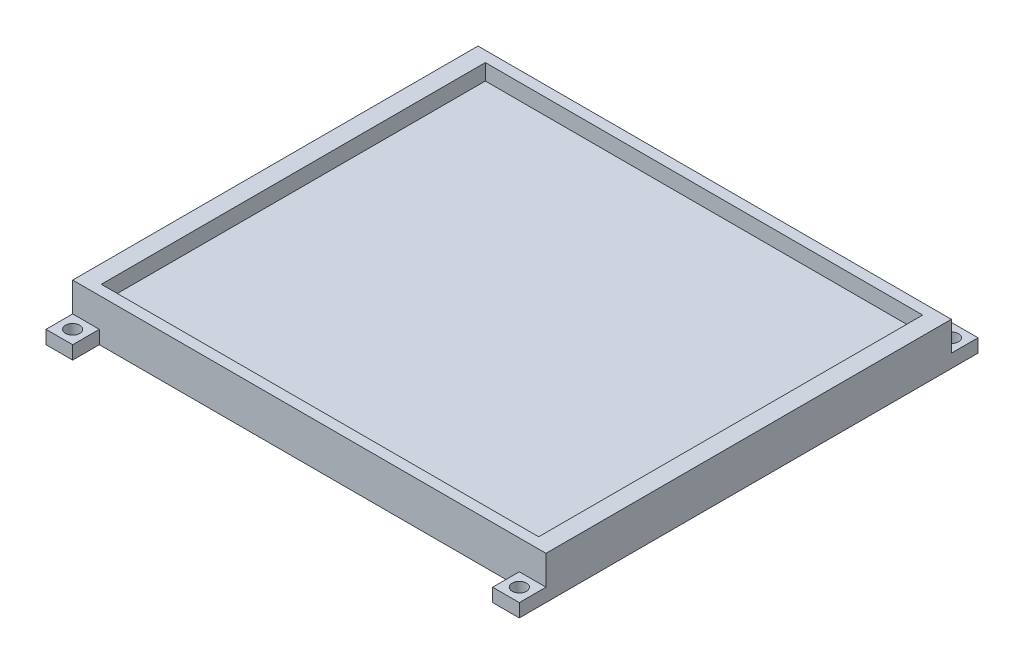
ISO-10303-21;
HEADER;
FILE_DESCRIPTION(('STEP AP214'),'2;1');
FILE_NAME('part.step','',(''),(''),'','','');
FILE_SCHEMA(('AUTOMOTIVE_DESIGN { 1 0 10303 214 1 1 1 1 }'));
ENDSEC;
DATA;
#1=APPLICATION_CONTEXT('core data for automotive mechanical design processes');
#2=APPLICATION_PROTOCOL_DEFINITION('international standard','automotive_design',2000,#1);
#3=PRODUCT_CONTEXT('',#1,'mechanical');
#4=PRODUCT('Part','Part','',(#3));
#5=PRODUCT_RELATED_PRODUCT_CATEGORY('part','',(#4));
#6=PRODUCT_DEFINITION_FORMATION('','',#4);
#7=PRODUCT_DEFINITION_CONTEXT('part definition',#1,'design');
#8=PRODUCT_DEFINITION('design','',#6,#7);
#9=PRODUCT_DEFINITION_SHAPE('','',#8);
#10=(LENGTH_UNIT() NAMED_UNIT(*) SI_UNIT(.MILLI.,.METRE.));
#11=(NAMED_UNIT(*) PLANE_ANGLE_UNIT() SI_UNIT($,.RADIAN.));
#12=(NAMED_UNIT(*) SI_UNIT($,.STERADIAN.) SOLID_ANGLE_UNIT());
#13=UNCERTAINTY_MEASURE_WITH_UNIT(LENGTH_MEASURE(1.E-05),#10,'distance_accuracy_value','');
#14=(GEOMETRIC_REPRESENTATION_CONTEXT(3) GLOBAL_UNCERTAINTY_ASSIGNED_CONTEXT((#13)) GLOBAL_UNIT_ASSIGNED_CONTEXT((#10,
#11,#12)) REPRESENTATION_CONTEXT('',''));
#15=CARTESIAN_POINT('',(0.,0.,0.));
#16=DIRECTION('',(0.,0.,1.));
#17=DIRECTION('',(1.,0.,0.));
#18=AXIS2_PLACEMENT_3D('',#15,#16,#17);
#19=CARTESIAN_POINT('',(0.,10.16,-96.52));
#20=DIRECTION('',(0.,0.,1.));
#21=DIRECTION('',(1.,0.,0.));
#22=AXIS2_PLACEMENT_3D('',#19,#20,#21);
#23=PLANE('',#22);
#24=DIRECTION('',(-1.,0.,0.));
#25=VECTOR('',#24,1.);
#26=CARTESIAN_POINT('',(112.699999898,3.175,-96.52));
#27=LINE('',#26,#25);
#28=CARTESIAN_POINT('',(112.699999898,3.175,-96.52));
#29=VERTEX_POINT('',#28);
#30=CARTESIAN_POINT('',(106.349999898,3.175,-96.52));
#31=VERTEX_POINT('',#30);
#32=EDGE_CURVE('E62',#29,#31,#27,.T.);
#33=ORIENTED_EDGE('',*,*,#32,.T.);
#34=DIRECTION('',(0.,-1.,0.));
#35=VECTOR('',#34,1.);
#36=CARTESIAN_POINT('',(106.349999898,3.175,-96.52));
#37=LINE('',#36,#35);
#38=CARTESIAN_POINT('',(106.349999898,0.,-96.52));
#39=VERTEX_POINT('',#38);
#40=EDGE_CURVE('E239',#31,#39,#37,.T.);
#41=ORIENTED_EDGE('',*,*,#40,.T.);
#42=DIRECTION('',(-1.,0.,0.));
#43=VECTOR('',#42,1.);
#44=CARTESIAN_POINT('',(0.,0.,-96.52));
#45=LINE('',#44,#43);
#46=CARTESIAN_POINT('',(6.35,0.,-96.52));
#47=VERTEX_POINT('',#46);
#48=EDGE_CURVE('E397',#39,#47,#45,.T.);
#49=ORIENTED_EDGE('',*,*,#48,.T.);
#50=DIRECTION('',(0.,-1.,0.));
#51=VECTOR('',#50,1.);
#52=CARTESIAN_POINT('',(6.35,3.175,-96.52));
#53=LINE('',#52,#51);
#54=CARTESIAN_POINT('',(6.35,3.175,-96.52));
#55=VERTEX_POINT('',#54);
#56=EDGE_CURVE('E265',#55,#47,#53,.T.);
#57=ORIENTED_EDGE('',*,*,#56,.F.);
#58=DIRECTION('',(-1.,0.,0.));
#59=VECTOR('',#58,1.);
#60=CARTESIAN_POINT('',(0.,3.175,-96.52));
#61=LINE('',#60,#59);
#62=CARTESIAN_POINT('',(0.,3.175,-96.52));
#63=VERTEX_POINT('',#62);
#64=EDGE_CURVE('E271',#55,#63,#61,.T.);
#65=ORIENTED_EDGE('',*,*,#64,.T.);
#66=DIRECTION('',(0.,-1.,0.));
#67=VECTOR('',#66,1.);
#68=CARTESIAN_POINT('',(0.,10.16,-96.52));
#69=LINE('',#68,#67);
#70=CARTESIAN_POINT('',(0.,10.16,-96.52));
#71=VERTEX_POINT('',#70);
#72=EDGE_CURVE('E403',#71,#63,#69,.T.);
#73=ORIENTED_EDGE('',*,*,#72,.F.);
#74=DIRECTION('',(-1.,0.,0.));
#75=VECTOR('',#74,1.);
#76=CARTESIAN_POINT('',(0.,10.16,-96.52));
#77=LINE('',#76,#75);
#78=CARTESIAN_POINT('',(112.699999898,10.16,-96.52));
#79=VERTEX_POINT('',#78);
#80=EDGE_CURVE('E401',#79,#71,#77,.T.);
#81=ORIENTED_EDGE('',*,*,#80,.F.);
#82=DIRECTION('',(0.,-1.,0.));
#83=VECTOR('',#82,1.);
#84=CARTESIAN_POINT('',(112.699999898,10.16,-96.52));
#85=LINE('',#84,#83);
#86=EDGE_CURVE('E412',#79,#29,#85,.T.);
#87=ORIENTED_EDGE('',*,*,#86,.T.);
#88=EDGE_LOOP('',(#33,#41,#49,#57,#65,#73,#81,#87));
#89=FACE_BOUND('',#88,.T.);
#90=ADVANCED_FACE('F39',(#89),#23,.F.);
#91=CARTESIAN_POINT('',(0.,10.16,0.));
#92=DIRECTION('',(0.,0.,-1.));
#93=DIRECTION('',(-1.,0.,0.));
#94=AXIS2_PLACEMENT_3D('',#91,#92,#93);
#95=PLANE('',#94);
#96=DIRECTION('',(1.,0.,0.));
#97=VECTOR('',#96,1.);
#98=CARTESIAN_POINT('',(0.,3.175,0.));
#99=LINE('',#98,#97);
#100=CARTESIAN_POINT('',(0.,3.175,0.));
#101=VERTEX_POINT('',#100);
#102=CARTESIAN_POINT('',(6.35,3.175,0.));
#103=VERTEX_POINT('',#102);
#104=EDGE_CURVE('E320',#101,#103,#99,.T.);
#105=ORIENTED_EDGE('',*,*,#104,.T.);
#106=DIRECTION('',(0.,-1.,0.));
#107=VECTOR('',#106,1.);
#108=CARTESIAN_POINT('',(6.35,3.175,0.));
#109=LINE('',#108,#107);
#110=CARTESIAN_POINT('',(6.35,0.,0.));
#111=VERTEX_POINT('',#110);
#112=EDGE_CURVE('E299',#103,#111,#109,.T.);
#113=ORIENTED_EDGE('',*,*,#112,.T.);
#114=DIRECTION('',(1.,0.,0.));
#115=VECTOR('',#114,1.);
#116=CARTESIAN_POINT('',(0.,0.,0.));
#117=LINE('',#116,#115);
#118=CARTESIAN_POINT('',(106.349999898,0.,0.));
#119=VERTEX_POINT('',#118);
#120=EDGE_CURVE('E405',#111,#119,#117,.T.);
#121=ORIENTED_EDGE('',*,*,#120,.T.);
#122=DIRECTION('',(0.,-1.,0.));
#123=VECTOR('',#122,1.);
#124=CARTESIAN_POINT('',(106.349999898,3.175,0.));
#125=LINE('',#124,#123);
#126=CARTESIAN_POINT('',(106.349999898,3.175,0.));
#127=VERTEX_POINT('',#126);
#128=EDGE_CURVE('E353',#127,#119,#125,.T.);
#129=ORIENTED_EDGE('',*,*,#128,.F.);
#130=DIRECTION('',(1.,0.,0.));
#131=VECTOR('',#130,1.);
#132=CARTESIAN_POINT('',(112.699999898,3.175,0.));
#133=LINE('',#132,#131);
#134=CARTESIAN_POINT('',(112.699999898,3.175,0.));
#135=VERTEX_POINT('',#134);
#136=EDGE_CURVE('E345',#127,#135,#133,.T.);
#137=ORIENTED_EDGE('',*,*,#136,.T.);
#138=DIRECTION('',(0.,-1.,0.));
#139=VECTOR('',#138,1.);
#140=CARTESIAN_POINT('',(112.699999898,10.16,0.));
#141=LINE('',#140,#139);
#142=CARTESIAN_POINT('',(112.699999898,10.16,0.));
#143=VERTEX_POINT('',#142);
#144=EDGE_CURVE('E47',#143,#135,#141,.T.);
#145=ORIENTED_EDGE('',*,*,#144,.F.);
#146=DIRECTION('',(1.,0.,0.));
#147=VECTOR('',#146,1.);
#148=CARTESIAN_POINT('',(0.,10.16,0.));
#149=LINE('',#148,#147);
#150=CARTESIAN_POINT('',(0.,10.16,0.));
#151=VERTEX_POINT('',#150);
#152=EDGE_CURVE('E396',#151,#143,#149,.T.);
#153=ORIENTED_EDGE('',*,*,#152,.F.);
#154=DIRECTION('',(0.,-1.,0.));
#155=VECTOR('',#154,1.);
#156=CARTESIAN_POINT('',(0.,10.16,0.));
#157=LINE('',#156,#155);
#158=EDGE_CURVE('E11',#151,#101,#157,.T.);
#159=ORIENTED_EDGE('',*,*,#158,.T.);
#160=EDGE_LOOP('',(#105,#113,#121,#129,#137,#145,#153,#159));
#161=FACE_BOUND('',#160,.T.);
#162=ADVANCED_FACE('F420',(#161),#95,.F.);
#163=CARTESIAN_POINT('',(0.,10.16,0.));
#164=DIRECTION('',(1.,0.,0.));
#165=DIRECTION('',(0.,0.,-1.));
#166=AXIS2_PLACEMENT_3D('',#163,#164,#165);
#167=PLANE('',#166);
#168=DIRECTION('',(0.,0.,1.));
#169=VECTOR('',#168,1.);
#170=CARTESIAN_POINT('',(0.,0.,0.));
#171=LINE('',#170,#169);
#172=CARTESIAN_POINT('',(0.,0.,-102.87));
#173=VERTEX_POINT('',#172);
#174=CARTESIAN_POINT('',(0.,0.,6.35));
#175=VERTEX_POINT('',#174);
#176=EDGE_CURVE('E386',#173,#175,#171,.T.);
#177=ORIENTED_EDGE('',*,*,#176,.T.);
#178=DIRECTION('',(0.,-1.,0.));
#179=VECTOR('',#178,1.);
#180=CARTESIAN_POINT('',(0.,3.175,6.35));
#181=LINE('',#180,#179);
#182=CARTESIAN_POINT('',(0.,3.175,6.35));
#183=VERTEX_POINT('',#182);
#184=EDGE_CURVE('E296',#183,#175,#181,.T.);
#185=ORIENTED_EDGE('',*,*,#184,.F.);
#186=DIRECTION('',(0.,0.,-1.));
#187=VECTOR('',#186,1.);
#188=CARTESIAN_POINT('',(0.,3.175,0.));
#189=LINE('',#188,#187);
#190=EDGE_CURVE('E311',#183,#101,#189,.T.);
#191=ORIENTED_EDGE('',*,*,#190,.T.);
#192=ORIENTED_EDGE('',*,*,#158,.F.);
#193=DIRECTION('',(0.,0.,1.));
#194=VECTOR('',#193,1.);
#195=CARTESIAN_POINT('',(0.,10.16,0.));
#196=LINE('',#195,#194);
#197=EDGE_CURVE('E393',#71,#151,#196,.T.);
#198=ORIENTED_EDGE('',*,*,#197,.F.);
#199=ORIENTED_EDGE('',*,*,#72,.T.);
#200=DIRECTION('',(0.,0.,-1.));
#201=VECTOR('',#200,1.);
#202=CARTESIAN_POINT('',(0.,3.175,-96.52));
#203=LINE('',#202,#201);
#204=CARTESIAN_POINT('',(0.,3.175,-102.87));
#205=VERTEX_POINT('',#204);
#206=EDGE_CURVE('E280',#63,#205,#203,.T.);
#207=ORIENTED_EDGE('',*,*,#206,.T.);
#208=DIRECTION('',(0.,-1.,0.));
#209=VECTOR('',#208,1.);
#210=CARTESIAN_POINT('',(0.,3.175,-102.87));
#211=LINE('',#210,#209);
#212=EDGE_CURVE('E268',#205,#173,#211,.T.);
#213=ORIENTED_EDGE('',*,*,#212,.T.);
#214=EDGE_LOOP('',(#177,#185,#191,#192,#198,#199,#207,#213));
#215=FACE_BOUND('',#214,.T.);
#216=ADVANCED_FACE('F41',(#215),#167,.F.);
#217=CARTESIAN_POINT('',(112.699999898,10.16,0.));
#218=DIRECTION('',(-1.,0.,0.));
#219=DIRECTION('',(0.,0.,1.));
#220=AXIS2_PLACEMENT_3D('',#217,#218,#219);
#221=PLANE('',#220);
#222=DIRECTION('',(0.,0.,-1.));
#223=VECTOR('',#222,1.);
#224=CARTESIAN_POINT('',(112.699999898,0.,0.));
#225=LINE('',#224,#223);
#226=CARTESIAN_POINT('',(112.699999898,0.,6.35));
#227=VERTEX_POINT('',#226);
#228=CARTESIAN_POINT('',(112.699999898,0.,-102.87));
#229=VERTEX_POINT('',#228);
#230=EDGE_CURVE('E407',#227,#229,#225,.T.);
#231=ORIENTED_EDGE('',*,*,#230,.T.);
#232=DIRECTION('',(0.,-1.,0.));
#233=VECTOR('',#232,1.);
#234=CARTESIAN_POINT('',(112.699999898,3.175,-102.87));
#235=LINE('',#234,#233);
#236=CARTESIAN_POINT('',(112.699999898,3.175,-102.87));
#237=VERTEX_POINT('',#236);
#238=EDGE_CURVE('E235',#237,#229,#235,.T.);
#239=ORIENTED_EDGE('',*,*,#238,.F.);
#240=DIRECTION('',(0.,0.,1.));
#241=VECTOR('',#240,1.);
#242=CARTESIAN_POINT('',(112.699999898,3.175,-96.52));
#243=LINE('',#242,#241);
#244=EDGE_CURVE('E250',#237,#29,#243,.T.);
#245=ORIENTED_EDGE('',*,*,#244,.T.);
#246=ORIENTED_EDGE('',*,*,#86,.F.);
#247=DIRECTION('',(0.,0.,-1.));
#248=VECTOR('',#247,1.);
#249=CARTESIAN_POINT('',(112.699999898,10.16,0.));
#250=LINE('',#249,#248);
#251=EDGE_CURVE('E399',#143,#79,#250,.T.);
#252=ORIENTED_EDGE('',*,*,#251,.F.);
#253=ORIENTED_EDGE('',*,*,#144,.T.);
#254=DIRECTION('',(0.,0.,1.));
#255=VECTOR('',#254,1.);
#256=CARTESIAN_POINT('',(112.699999898,3.175,0.));
#257=LINE('',#256,#255);
#258=CARTESIAN_POINT('',(112.699999898,3.175,6.35));
#259=VERTEX_POINT('',#258);
#260=EDGE_CURVE('E336',#135,#259,#257,.T.);
#261=ORIENTED_EDGE('',*,*,#260,.T.);
#262=DIRECTION('',(0.,-1.,0.));
#263=VECTOR('',#262,1.);
#264=CARTESIAN_POINT('',(112.699999898,3.175,6.35));
#265=LINE('',#264,#263);
#266=EDGE_CURVE('E348',#259,#227,#265,.T.);
#267=ORIENTED_EDGE('',*,*,#266,.T.);
#268=EDGE_LOOP('',(#231,#239,#245,#246,#252,#253,#261,#267));
#269=FACE_BOUND('',#268,.T.);
#270=ADVANCED_FACE('F417',(#269),#221,.F.);
#271=CARTESIAN_POINT('',(0.,10.16,0.));
#272=DIRECTION('',(0.,-1.,0.));
#273=DIRECTION('',(0.,0.,-1.));
#274=AXIS2_PLACEMENT_3D('',#271,#272,#273);
#275=PLANE('',#274);
#276=DIRECTION('',(1.,0.,0.));
#277=VECTOR('',#276,1.);
#278=CARTESIAN_POINT('',(4.279999949,10.16,-2.54000000000001));
#279=LINE('',#278,#277);
#280=CARTESIAN_POINT('',(4.279999949,10.16,-2.54000000000001));
#281=VERTEX_POINT('',#280);
#282=CARTESIAN_POINT('',(108.419999949,10.16,-2.54000000000001));
#283=VERTEX_POINT('',#282);
#284=EDGE_CURVE('E376',#281,#283,#279,.T.);
#285=ORIENTED_EDGE('',*,*,#284,.F.);
#286=DIRECTION('',(0.,0.,1.));
#287=VECTOR('',#286,1.);
#288=CARTESIAN_POINT('',(4.279999949,10.16,-2.54000000000001));
#289=LINE('',#288,#287);
#290=CARTESIAN_POINT('',(4.279999949,10.16,-93.98));
#291=VERTEX_POINT('',#290);
#292=EDGE_CURVE('E356',#291,#281,#289,.T.);
#293=ORIENTED_EDGE('',*,*,#292,.F.);
#294=DIRECTION('',(-1.,0.,0.));
#295=VECTOR('',#294,1.);
#296=CARTESIAN_POINT('',(4.279999949,10.16,-93.98));
#297=LINE('',#296,#295);
#298=CARTESIAN_POINT('',(108.419999949,10.16,-93.98));
#299=VERTEX_POINT('',#298);
#300=EDGE_CURVE('E365',#299,#291,#297,.T.);
#301=ORIENTED_EDGE('',*,*,#300,.F.);
#302=DIRECTION('',(0.,0.,-1.));
#303=VECTOR('',#302,1.);
#304=CARTESIAN_POINT('',(108.419999949,10.16,-2.54000000000001));
#305=LINE('',#304,#303);
#306=EDGE_CURVE('E379',#283,#299,#305,.T.);
#307=ORIENTED_EDGE('',*,*,#306,.F.);
#308=EDGE_LOOP('',(#285,#293,#301,#307));
#309=FACE_BOUND('',#308,.T.);
#310=ORIENTED_EDGE('',*,*,#197,.T.);
#311=ORIENTED_EDGE('',*,*,#152,.T.);
#312=ORIENTED_EDGE('',*,*,#251,.T.);
#313=ORIENTED_EDGE('',*,*,#80,.T.);
#314=EDGE_LOOP('',(#310,#311,#312,#313));
#315=FACE_BOUND('',#314,.T.);
#316=ADVANCED_FACE('F449',(#309,#315),#275,.F.);
#317=CARTESIAN_POINT('',(0.,0.,0.));
#318=DIRECTION('',(0.,-1.,0.));
#319=DIRECTION('',(0.,0.,-1.));
#320=AXIS2_PLACEMENT_3D('',#317,#318,#319);
#321=PLANE('',#320);
#322=DIRECTION('',(0.,0.,-1.));
#323=VECTOR('',#322,1.);
#324=CARTESIAN_POINT('',(6.35,0.,-6.35));
#325=LINE('',#324,#323);
#326=CARTESIAN_POINT('',(6.35,0.,-6.35));
#327=VERTEX_POINT('',#326);
#328=CARTESIAN_POINT('',(6.35000000000001,0.,-90.17));
#329=VERTEX_POINT('',#328);
#330=EDGE_CURVE('E54',#327,#329,#325,.T.);
#331=ORIENTED_EDGE('',*,*,#330,.F.);
#332=DIRECTION('',(-1.,0.,0.));
#333=VECTOR('',#332,1.);
#334=CARTESIAN_POINT('',(6.35,0.,-6.35));
#335=LINE('',#334,#333);
#336=CARTESIAN_POINT('',(106.349999898,0.,-6.35));
#337=VERTEX_POINT('',#336);
#338=EDGE_CURVE('E220',#337,#327,#335,.T.);
#339=ORIENTED_EDGE('',*,*,#338,.F.);
#340=DIRECTION('',(0.,0.,1.));
#341=VECTOR('',#340,1.);
#342=CARTESIAN_POINT('',(106.349999898,0.,-6.35));
#343=LINE('',#342,#341);
#344=CARTESIAN_POINT('',(106.349999898,0.,-90.17));
#345=VERTEX_POINT('',#344);
#346=EDGE_CURVE('E223',#345,#337,#343,.T.);
#347=ORIENTED_EDGE('',*,*,#346,.F.);
#348=DIRECTION('',(1.,0.,0.));
#349=VECTOR('',#348,1.);
#350=CARTESIAN_POINT('',(6.35000000000001,0.,-90.17));
#351=LINE('',#350,#349);
#352=EDGE_CURVE('E229',#329,#345,#351,.T.);
#353=ORIENTED_EDGE('',*,*,#352,.F.);
#354=EDGE_LOOP('',(#331,#339,#347,#353));
#355=FACE_BOUND('',#354,.T.);
#356=ORIENTED_EDGE('',*,*,#176,.F.);
#357=DIRECTION('',(1.,0.,0.));
#358=VECTOR('',#357,1.);
#359=CARTESIAN_POINT('',(0.,0.,-102.87));
#360=LINE('',#359,#358);
#361=CARTESIAN_POINT('',(6.35,0.,-102.87));
#362=VERTEX_POINT('',#361);
#363=EDGE_CURVE('E279',#173,#362,#360,.T.);
#364=ORIENTED_EDGE('',*,*,#363,.T.);
#365=DIRECTION('',(0.,0.,1.));
#366=VECTOR('',#365,1.);
#367=CARTESIAN_POINT('',(6.35,0.,-96.52));
#368=LINE('',#367,#366);
#369=EDGE_CURVE('E276',#362,#47,#368,.T.);
#370=ORIENTED_EDGE('',*,*,#369,.T.);
#371=ORIENTED_EDGE('',*,*,#48,.F.);
#372=DIRECTION('',(0.,0.,-1.));
#373=VECTOR('',#372,1.);
#374=CARTESIAN_POINT('',(106.349999898,0.,-96.52));
#375=LINE('',#374,#373);
#376=CARTESIAN_POINT('',(106.349999898,0.,-102.87));
#377=VERTEX_POINT('',#376);
#378=EDGE_CURVE('E249',#39,#377,#375,.T.);
#379=ORIENTED_EDGE('',*,*,#378,.T.);
#380=DIRECTION('',(1.,0.,0.));
#381=VECTOR('',#380,1.);
#382=CARTESIAN_POINT('',(112.699999898,0.,-102.87));
#383=LINE('',#382,#381);
#384=EDGE_CURVE('E246',#377,#229,#383,.T.);
#385=ORIENTED_EDGE('',*,*,#384,.T.);
#386=ORIENTED_EDGE('',*,*,#230,.F.);
#387=DIRECTION('',(-1.,0.,0.));
#388=VECTOR('',#387,1.);
#389=CARTESIAN_POINT('',(112.699999898,0.,6.35));
#390=LINE('',#389,#388);
#391=CARTESIAN_POINT('',(106.349999898,0.,6.35));
#392=VERTEX_POINT('',#391);
#393=EDGE_CURVE('E333',#227,#392,#390,.T.);
#394=ORIENTED_EDGE('',*,*,#393,.T.);
#395=DIRECTION('',(0.,0.,-1.));
#396=VECTOR('',#395,1.);
#397=CARTESIAN_POINT('',(106.349999898,0.,0.));
#398=LINE('',#397,#396);
#399=EDGE_CURVE('E340',#392,#119,#398,.T.);
#400=ORIENTED_EDGE('',*,*,#399,.T.);
#401=ORIENTED_EDGE('',*,*,#120,.F.);
#402=DIRECTION('',(0.,0.,1.));
#403=VECTOR('',#402,1.);
#404=CARTESIAN_POINT('',(6.35,0.,0.));
#405=LINE('',#404,#403);
#406=CARTESIAN_POINT('',(6.35,0.,6.35));
#407=VERTEX_POINT('',#406);
#408=EDGE_CURVE('E310',#111,#407,#405,.T.);
#409=ORIENTED_EDGE('',*,*,#408,.T.);
#410=DIRECTION('',(-1.,0.,0.));
#411=VECTOR('',#410,1.);
#412=CARTESIAN_POINT('',(0.,0.,6.35));
#413=LINE('',#412,#411);
#414=EDGE_CURVE('E307',#407,#175,#413,.T.);
#415=ORIENTED_EDGE('',*,*,#414,.T.);
#416=EDGE_LOOP('',(#356,#364,#370,#371,#379,#385,#386,#394,#400,#401,#409,#415));
#417=FACE_BOUND('',#416,.T.);
#418=CARTESIAN_POINT('',(109.524999898,0.,3.175));
#419=DIRECTION('',(0.,-1.,0.));
#420=DIRECTION('',(0.,0.,-1.));
#421=AXIS2_PLACEMENT_3D('',#418,#419,#420);
#422=CIRCLE('',#421,1.7);
#423=CARTESIAN_POINT('',(109.524999898,0.,1.475));
#424=VERTEX_POINT('',#423);
#425=EDGE_CURVE('E327',#424,#424,#422,.T.);
#426=ORIENTED_EDGE('',*,*,#425,.F.);
#427=EDGE_LOOP('',(#426));
#428=FACE_BOUND('',#427,.T.);
#429=CARTESIAN_POINT('',(3.175,0.,3.175));
#430=DIRECTION('',(0.,-1.,0.));
#431=DIRECTION('',(0.,0.,-1.));
#432=AXIS2_PLACEMENT_3D('',#429,#430,#431);
#433=CIRCLE('',#432,1.7);
#434=CARTESIAN_POINT('',(3.175,0.,1.475));
#435=VERTEX_POINT('',#434);
#436=EDGE_CURVE('E324',#435,#435,#433,.T.);
#437=ORIENTED_EDGE('',*,*,#436,.F.);
#438=EDGE_LOOP('',(#437));
#439=FACE_BOUND('',#438,.T.);
#440=CARTESIAN_POINT('',(3.175,0.,-99.695));
#441=DIRECTION('',(0.,-1.,0.));
#442=DIRECTION('',(0.,0.,-1.));
#443=AXIS2_PLACEMENT_3D('',#440,#441,#442);
#444=CIRCLE('',#443,1.7);
#445=CARTESIAN_POINT('',(3.175,0.,-101.395));
#446=VERTEX_POINT('',#445);
#447=EDGE_CURVE('E293',#446,#446,#444,.T.);
#448=ORIENTED_EDGE('',*,*,#447,.F.);
#449=EDGE_LOOP('',(#448));
#450=FACE_BOUND('',#449,.T.);
#451=CARTESIAN_POINT('',(109.524999898,0.,-99.695));
#452=DIRECTION('',(0.,-1.,0.));
#453=DIRECTION('',(0.,0.,-1.));
#454=AXIS2_PLACEMENT_3D('',#451,#452,#453);
#455=CIRCLE('',#454,1.7);
#456=CARTESIAN_POINT('',(109.524999898,0.,-101.395));
#457=VERTEX_POINT('',#456);
#458=EDGE_CURVE('E262',#457,#457,#455,.T.);
#459=ORIENTED_EDGE('',*,*,#458,.F.);
#460=EDGE_LOOP('',(#459));
#461=FACE_BOUND('',#460,.T.);
#462=ADVANCED_FACE('F437',(#355,#417,#428,#439,#450,#461),#321,.T.);
#463=CARTESIAN_POINT('',(4.279999949,6.35,-2.54000000000001));
#464=DIRECTION('',(-1.,0.,0.));
#465=DIRECTION('',(0.,0.,1.));
#466=AXIS2_PLACEMENT_3D('',#463,#464,#465);
#467=PLANE('',#466);
#468=ORIENTED_EDGE('',*,*,#292,.T.);
#469=DIRECTION('',(0.,1.,0.));
#470=VECTOR('',#469,1.);
#471=CARTESIAN_POINT('',(4.279999949,6.35,-2.54000000000001));
#472=LINE('',#471,#470);
#473=CARTESIAN_POINT('',(4.279999949,6.35,-2.54000000000001));
#474=VERTEX_POINT('',#473);
#475=EDGE_CURVE('E374',#474,#281,#472,.T.);
#476=ORIENTED_EDGE('',*,*,#475,.F.);
#477=DIRECTION('',(0.,0.,1.));
#478=VECTOR('',#477,1.);
#479=CARTESIAN_POINT('',(4.279999949,6.35,-2.54000000000001));
#480=LINE('',#479,#478);
#481=CARTESIAN_POINT('',(4.279999949,6.35,-93.98));
#482=VERTEX_POINT('',#481);
#483=EDGE_CURVE('E361',#482,#474,#480,.T.);
#484=ORIENTED_EDGE('',*,*,#483,.F.);
#485=DIRECTION('',(0.,1.,0.));
#486=VECTOR('',#485,1.);
#487=CARTESIAN_POINT('',(4.279999949,6.35,-93.98));
#488=LINE('',#487,#486);
#489=EDGE_CURVE('E384',#482,#291,#488,.T.);
#490=ORIENTED_EDGE('',*,*,#489,.T.);
#491=EDGE_LOOP('',(#468,#476,#484,#490));
#492=FACE_BOUND('',#491,.T.);
#493=ADVANCED_FACE('F539',(#492),#467,.F.);
#494=CARTESIAN_POINT('',(4.279999949,6.35,-93.98));
#495=DIRECTION('',(0.,0.,-1.));
#496=DIRECTION('',(-1.,0.,0.));
#497=AXIS2_PLACEMENT_3D('',#494,#495,#496);
#498=PLANE('',#497);
#499=ORIENTED_EDGE('',*,*,#300,.T.);
#500=ORIENTED_EDGE('',*,*,#489,.F.);
#501=DIRECTION('',(-1.,0.,0.));
#502=VECTOR('',#501,1.);
#503=CARTESIAN_POINT('',(4.279999949,6.35,-93.98));
#504=LINE('',#503,#502);
#505=CARTESIAN_POINT('',(108.419999949,6.35,-93.98));
#506=VERTEX_POINT('',#505);
#507=EDGE_CURVE('E371',#506,#482,#504,.T.);
#508=ORIENTED_EDGE('',*,*,#507,.F.);
#509=DIRECTION('',(0.,1.,0.));
#510=VECTOR('',#509,1.);
#511=CARTESIAN_POINT('',(108.419999949,6.35,-93.98));
#512=LINE('',#511,#510);
#513=EDGE_CURVE('E387',#506,#299,#512,.T.);
#514=ORIENTED_EDGE('',*,*,#513,.T.);
#515=EDGE_LOOP('',(#499,#500,#508,#514));
#516=FACE_BOUND('',#515,.T.);
#517=ADVANCED_FACE('F528',(#516),#498,.F.);
#518=CARTESIAN_POINT('',(108.419999949,6.35,-2.54000000000001));
#519=DIRECTION('',(1.,0.,0.));
#520=DIRECTION('',(0.,0.,-1.));
#521=AXIS2_PLACEMENT_3D('',#518,#519,#520);
#522=PLANE('',#521);
#523=ORIENTED_EDGE('',*,*,#306,.T.);
#524=ORIENTED_EDGE('',*,*,#513,.F.);
#525=DIRECTION('',(0.,0.,-1.));
#526=VECTOR('',#525,1.);
#527=CARTESIAN_POINT('',(108.419999949,6.35,-2.54000000000001));
#528=LINE('',#527,#526);
#529=CARTESIAN_POINT('',(108.419999949,6.35,-2.54000000000001));
#530=VERTEX_POINT('',#529);
#531=EDGE_CURVE('E368',#530,#506,#528,.T.);
#532=ORIENTED_EDGE('',*,*,#531,.F.);
#533=DIRECTION('',(0.,1.,0.));
#534=VECTOR('',#533,1.);
#535=CARTESIAN_POINT('',(108.419999949,6.35,-2.54000000000001));
#536=LINE('',#535,#534);
#537=EDGE_CURVE('E389',#530,#283,#536,.T.);
#538=ORIENTED_EDGE('',*,*,#537,.T.);
#539=EDGE_LOOP('',(#523,#524,#532,#538));
#540=FACE_BOUND('',#539,.T.);
#541=ADVANCED_FACE('F517',(#540),#522,.F.);
#542=CARTESIAN_POINT('',(4.279999949,6.35,-2.54000000000001));
#543=DIRECTION('',(0.,0.,1.));
#544=DIRECTION('',(1.,0.,0.));
#545=AXIS2_PLACEMENT_3D('',#542,#543,#544);
#546=PLANE('',#545);
#547=ORIENTED_EDGE('',*,*,#284,.T.);
#548=ORIENTED_EDGE('',*,*,#537,.F.);
#549=DIRECTION('',(1.,0.,0.));
#550=VECTOR('',#549,1.);
#551=CARTESIAN_POINT('',(4.279999949,6.35,-2.54000000000001));
#552=LINE('',#551,#550);
#553=EDGE_CURVE('E364',#474,#530,#552,.T.);
#554=ORIENTED_EDGE('',*,*,#553,.F.);
#555=ORIENTED_EDGE('',*,*,#475,.T.);
#556=EDGE_LOOP('',(#547,#548,#554,#555));
#557=FACE_BOUND('',#556,.T.);
#558=ADVANCED_FACE('F472',(#557),#546,.F.);
#559=CARTESIAN_POINT('',(0.,6.35,0.));
#560=DIRECTION('',(0.,-1.,0.));
#561=DIRECTION('',(0.,0.,-1.));
#562=AXIS2_PLACEMENT_3D('',#559,#560,#561);
#563=PLANE('',#562);
#564=ORIENTED_EDGE('',*,*,#483,.T.);
#565=ORIENTED_EDGE('',*,*,#553,.T.);
#566=ORIENTED_EDGE('',*,*,#531,.T.);
#567=ORIENTED_EDGE('',*,*,#507,.T.);
#568=EDGE_LOOP('',(#564,#565,#566,#567));
#569=FACE_BOUND('',#568,.T.);
#570=ADVANCED_FACE('F465',(#569),#563,.F.);
#571=CARTESIAN_POINT('',(106.349999898,3.175,0.));
#572=DIRECTION('',(-1.,0.,0.));
#573=DIRECTION('',(0.,0.,1.));
#574=AXIS2_PLACEMENT_3D('',#571,#572,#573);
#575=PLANE('',#574);
#576=ORIENTED_EDGE('',*,*,#399,.F.);
#577=DIRECTION('',(0.,-1.,0.));
#578=VECTOR('',#577,1.);
#579=CARTESIAN_POINT('',(106.349999898,3.175,6.35));
#580=LINE('',#579,#578);
#581=CARTESIAN_POINT('',(106.349999898,3.175,6.35));
#582=VERTEX_POINT('',#581);
#583=EDGE_CURVE('E357',#582,#392,#580,.T.);
#584=ORIENTED_EDGE('',*,*,#583,.F.);
#585=DIRECTION('',(0.,0.,-1.));
#586=VECTOR('',#585,1.);
#587=CARTESIAN_POINT('',(106.349999898,3.175,0.));
#588=LINE('',#587,#586);
#589=EDGE_CURVE('E343',#582,#127,#588,.T.);
#590=ORIENTED_EDGE('',*,*,#589,.T.);
#591=ORIENTED_EDGE('',*,*,#128,.T.);
#592=EDGE_LOOP('',(#576,#584,#590,#591));
#593=FACE_BOUND('',#592,.T.);
#594=ADVANCED_FACE('F463',(#593),#575,.T.);
#595=CARTESIAN_POINT('',(112.699999898,3.175,6.35));
#596=DIRECTION('',(0.,0.,1.));
#597=DIRECTION('',(1.,0.,0.));
#598=AXIS2_PLACEMENT_3D('',#595,#596,#597);
#599=PLANE('',#598);
#600=ORIENTED_EDGE('',*,*,#393,.F.);
#601=ORIENTED_EDGE('',*,*,#266,.F.);
#602=DIRECTION('',(-1.,0.,0.));
#603=VECTOR('',#602,1.);
#604=CARTESIAN_POINT('',(112.699999898,3.175,6.35));
#605=LINE('',#604,#603);
#606=EDGE_CURVE('E339',#259,#582,#605,.T.);
#607=ORIENTED_EDGE('',*,*,#606,.T.);
#608=ORIENTED_EDGE('',*,*,#583,.T.);
#609=EDGE_LOOP('',(#600,#601,#607,#608));
#610=FACE_BOUND('',#609,.T.);
#611=ADVANCED_FACE('F429',(#610),#599,.T.);
#612=CARTESIAN_POINT('',(0.,3.175,0.));
#613=DIRECTION('',(0.,-1.,0.));
#614=DIRECTION('',(0.,0.,-1.));
#615=AXIS2_PLACEMENT_3D('',#612,#613,#614);
#616=PLANE('',#615);
#617=CARTESIAN_POINT('',(109.524999898,3.175,3.175));
#618=DIRECTION('',(0.,-1.,0.));
#619=DIRECTION('',(0.,0.,-1.));
#620=AXIS2_PLACEMENT_3D('',#617,#618,#619);
#621=CIRCLE('',#620,1.7);
#622=CARTESIAN_POINT('',(109.524999898,3.175,1.475));
#623=VERTEX_POINT('',#622);
#624=EDGE_CURVE('E330',#623,#623,#621,.T.);
#625=ORIENTED_EDGE('',*,*,#624,.T.);
#626=EDGE_LOOP('',(#625));
#627=FACE_BOUND('',#626,.T.);
#628=ORIENTED_EDGE('',*,*,#260,.F.);
#629=ORIENTED_EDGE('',*,*,#136,.F.);
#630=ORIENTED_EDGE('',*,*,#589,.F.);
#631=ORIENTED_EDGE('',*,*,#606,.F.);
#632=EDGE_LOOP('',(#628,#629,#630,#631));
#633=FACE_BOUND('',#632,.T.);
#634=ADVANCED_FACE('F425',(#627,#633),#616,.F.);
#635=CARTESIAN_POINT('',(109.524999898,3.175,3.175));
#636=DIRECTION('',(0.,-1.,0.));
#637=DIRECTION('',(0.,0.,-1.));
#638=AXIS2_PLACEMENT_3D('',#635,#636,#637);
#639=CYLINDRICAL_SURFACE('',#638,1.7);
#640=ORIENTED_EDGE('',*,*,#624,.F.);
#641=EDGE_LOOP('',(#640));
#642=FACE_BOUND('',#641,.T.);
#643=ORIENTED_EDGE('',*,*,#425,.T.);
#644=EDGE_LOOP('',(#643));
#645=FACE_BOUND('',#644,.T.);
#646=ADVANCED_FACE('F737',(#642,#645),#639,.F.);
#647=CARTESIAN_POINT('',(0.,3.175,6.35));
#648=DIRECTION('',(0.,0.,1.));
#649=DIRECTION('',(1.,0.,0.));
#650=AXIS2_PLACEMENT_3D('',#647,#648,#649);
#651=PLANE('',#650);
#652=ORIENTED_EDGE('',*,*,#414,.F.);
#653=DIRECTION('',(0.,-1.,0.));
#654=VECTOR('',#653,1.);
#655=CARTESIAN_POINT('',(6.35,3.175,6.35));
#656=LINE('',#655,#654);
#657=CARTESIAN_POINT('',(6.35,3.175,6.35));
#658=VERTEX_POINT('',#657);
#659=EDGE_CURVE('E303',#658,#407,#656,.T.);
#660=ORIENTED_EDGE('',*,*,#659,.F.);
#661=DIRECTION('',(-1.,0.,0.));
#662=VECTOR('',#661,1.);
#663=CARTESIAN_POINT('',(0.,3.175,6.35));
#664=LINE('',#663,#662);
#665=EDGE_CURVE('E302',#658,#183,#664,.T.);
#666=ORIENTED_EDGE('',*,*,#665,.T.);
#667=ORIENTED_EDGE('',*,*,#184,.T.);
#668=EDGE_LOOP('',(#652,#660,#666,#667));
#669=FACE_BOUND('',#668,.T.);
#670=ADVANCED_FACE('F728',(#669),#651,.T.);
#671=CARTESIAN_POINT('',(6.35,3.175,0.));
#672=DIRECTION('',(1.,0.,0.));
#673=DIRECTION('',(0.,0.,-1.));
#674=AXIS2_PLACEMENT_3D('',#671,#672,#673);
#675=PLANE('',#674);
#676=ORIENTED_EDGE('',*,*,#408,.F.);
#677=ORIENTED_EDGE('',*,*,#112,.F.);
#678=DIRECTION('',(0.,0.,1.));
#679=VECTOR('',#678,1.);
#680=CARTESIAN_POINT('',(6.35,3.175,0.));
#681=LINE('',#680,#679);
#682=EDGE_CURVE('E317',#103,#658,#681,.T.);
#683=ORIENTED_EDGE('',*,*,#682,.T.);
#684=ORIENTED_EDGE('',*,*,#659,.T.);
#685=EDGE_LOOP('',(#676,#677,#683,#684));
#686=FACE_BOUND('',#685,.T.);
#687=ADVANCED_FACE('F461',(#686),#675,.T.);
#688=CARTESIAN_POINT('',(0.,3.175,0.));
#689=DIRECTION('',(0.,1.,0.));
#690=DIRECTION('',(0.,0.,1.));
#691=AXIS2_PLACEMENT_3D('',#688,#689,#690);
#692=PLANE('',#691);
#693=CARTESIAN_POINT('',(3.175,3.175,3.175));
#694=DIRECTION('',(0.,-1.,0.));
#695=DIRECTION('',(0.,0.,-1.));
#696=AXIS2_PLACEMENT_3D('',#693,#694,#695);
#697=CIRCLE('',#696,1.7);
#698=CARTESIAN_POINT('',(3.175,3.175,1.475));
#699=VERTEX_POINT('',#698);
#700=EDGE_CURVE('E314',#699,#699,#697,.T.);
#701=ORIENTED_EDGE('',*,*,#700,.T.);
#702=EDGE_LOOP('',(#701));
#703=FACE_BOUND('',#702,.T.);
#704=ORIENTED_EDGE('',*,*,#190,.F.);
#705=ORIENTED_EDGE('',*,*,#665,.F.);
#706=ORIENTED_EDGE('',*,*,#682,.F.);
#707=ORIENTED_EDGE('',*,*,#104,.F.);
#708=EDGE_LOOP('',(#704,#705,#706,#707));
#709=FACE_BOUND('',#708,.T.);
#710=ADVANCED_FACE('F457',(#703,#709),#692,.T.);
#711=CARTESIAN_POINT('',(3.175,3.175,3.175));
#712=DIRECTION('',(0.,-1.,0.));
#713=DIRECTION('',(0.,0.,-1.));
#714=AXIS2_PLACEMENT_3D('',#711,#712,#713);
#715=CYLINDRICAL_SURFACE('',#714,1.7);
#716=ORIENTED_EDGE('',*,*,#700,.F.);
#717=EDGE_LOOP('',(#716));
#718=FACE_BOUND('',#717,.T.);
#719=ORIENTED_EDGE('',*,*,#436,.T.);
#720=EDGE_LOOP('',(#719));
#721=FACE_BOUND('',#720,.T.);
#722=ADVANCED_FACE('F700',(#718,#721),#715,.F.);
#723=CARTESIAN_POINT('',(6.35,3.175,-96.52));
#724=DIRECTION('',(1.,0.,0.));
#725=DIRECTION('',(0.,0.,-1.));
#726=AXIS2_PLACEMENT_3D('',#723,#724,#725);
#727=PLANE('',#726);
#728=ORIENTED_EDGE('',*,*,#369,.F.);
#729=DIRECTION('',(0.,-1.,0.));
#730=VECTOR('',#729,1.);
#731=CARTESIAN_POINT('',(6.35,3.175,-102.87));
#732=LINE('',#731,#730);
#733=CARTESIAN_POINT('',(6.35,3.175,-102.87));
#734=VERTEX_POINT('',#733);
#735=EDGE_CURVE('E272',#734,#362,#732,.T.);
#736=ORIENTED_EDGE('',*,*,#735,.F.);
#737=DIRECTION('',(0.,0.,1.));
#738=VECTOR('',#737,1.);
#739=CARTESIAN_POINT('',(6.35,3.175,-96.52));
#740=LINE('',#739,#738);
#741=EDGE_CURVE('E286',#734,#55,#740,.T.);
#742=ORIENTED_EDGE('',*,*,#741,.T.);
#743=ORIENTED_EDGE('',*,*,#56,.T.);
#744=EDGE_LOOP('',(#728,#736,#742,#743));
#745=FACE_BOUND('',#744,.T.);
#746=ADVANCED_FACE('F690',(#745),#727,.T.);
#747=CARTESIAN_POINT('',(0.,3.175,-102.87));
#748=DIRECTION('',(0.,0.,-1.));
#749=DIRECTION('',(-1.,0.,0.));
#750=AXIS2_PLACEMENT_3D('',#747,#748,#749);
#751=PLANE('',#750);
#752=ORIENTED_EDGE('',*,*,#363,.F.);
#753=ORIENTED_EDGE('',*,*,#212,.F.);
#754=DIRECTION('',(1.,0.,0.));
#755=VECTOR('',#754,1.);
#756=CARTESIAN_POINT('',(0.,3.175,-102.87));
#757=LINE('',#756,#755);
#758=EDGE_CURVE('E288',#205,#734,#757,.T.);
#759=ORIENTED_EDGE('',*,*,#758,.T.);
#760=ORIENTED_EDGE('',*,*,#735,.T.);
#761=EDGE_LOOP('',(#752,#753,#759,#760));
#762=FACE_BOUND('',#761,.T.);
#763=ADVANCED_FACE('F680',(#762),#751,.T.);
#764=CARTESIAN_POINT('',(0.,3.175,0.));
#765=DIRECTION('',(0.,-1.,0.));
#766=DIRECTION('',(0.,0.,-1.));
#767=AXIS2_PLACEMENT_3D('',#764,#765,#766);
#768=PLANE('',#767);
#769=CARTESIAN_POINT('',(3.175,3.175,-99.695));
#770=DIRECTION('',(0.,-1.,0.));
#771=DIRECTION('',(0.,0.,-1.));
#772=AXIS2_PLACEMENT_3D('',#769,#770,#771);
#773=CIRCLE('',#772,1.7);
#774=CARTESIAN_POINT('',(3.175,3.175,-101.395));
#775=VERTEX_POINT('',#774);
#776=EDGE_CURVE('E283',#775,#775,#773,.T.);
#777=ORIENTED_EDGE('',*,*,#776,.T.);
#778=EDGE_LOOP('',(#777));
#779=FACE_BOUND('',#778,.T.);
#780=ORIENTED_EDGE('',*,*,#206,.F.);
#781=ORIENTED_EDGE('',*,*,#64,.F.);
#782=ORIENTED_EDGE('',*,*,#741,.F.);
#783=ORIENTED_EDGE('',*,*,#758,.F.);
#784=EDGE_LOOP('',(#780,#781,#782,#783));
#785=FACE_BOUND('',#784,.T.);
#786=ADVANCED_FACE('F670',(#779,#785),#768,.F.);
#787=CARTESIAN_POINT('',(3.175,3.175,-99.695));
#788=DIRECTION('',(0.,-1.,0.));
#789=DIRECTION('',(0.,0.,-1.));
#790=AXIS2_PLACEMENT_3D('',#787,#788,#789);
#791=CYLINDRICAL_SURFACE('',#790,1.7);
#792=ORIENTED_EDGE('',*,*,#776,.F.);
#793=EDGE_LOOP('',(#792));
#794=FACE_BOUND('',#793,.T.);
#795=ORIENTED_EDGE('',*,*,#447,.T.);
#796=EDGE_LOOP('',(#795));
#797=FACE_BOUND('',#796,.T.);
#798=ADVANCED_FACE('F661',(#794,#797),#791,.F.);
#799=CARTESIAN_POINT('',(112.699999898,3.175,-102.87));
#800=DIRECTION('',(0.,0.,-1.));
#801=DIRECTION('',(-1.,0.,0.));
#802=AXIS2_PLACEMENT_3D('',#799,#800,#801);
#803=PLANE('',#802);
#804=ORIENTED_EDGE('',*,*,#384,.F.);
#805=DIRECTION('',(0.,-1.,0.));
#806=VECTOR('',#805,1.);
#807=CARTESIAN_POINT('',(106.349999898,3.175,-102.87));
#808=LINE('',#807,#806);
#809=CARTESIAN_POINT('',(106.349999898,3.175,-102.87));
#810=VERTEX_POINT('',#809);
#811=EDGE_CURVE('E242',#810,#377,#808,.T.);
#812=ORIENTED_EDGE('',*,*,#811,.F.);
#813=DIRECTION('',(1.,0.,0.));
#814=VECTOR('',#813,1.);
#815=CARTESIAN_POINT('',(112.699999898,3.175,-102.87));
#816=LINE('',#815,#814);
#817=EDGE_CURVE('E241',#810,#237,#816,.T.);
#818=ORIENTED_EDGE('',*,*,#817,.T.);
#819=ORIENTED_EDGE('',*,*,#238,.T.);
#820=EDGE_LOOP('',(#804,#812,#818,#819));
#821=FACE_BOUND('',#820,.T.);
#822=ADVANCED_FACE('F435',(#821),#803,.T.);
#823=CARTESIAN_POINT('',(106.349999898,3.175,-96.52));
#824=DIRECTION('',(-1.,0.,0.));
#825=DIRECTION('',(0.,0.,1.));
#826=AXIS2_PLACEMENT_3D('',#823,#824,#825);
#827=PLANE('',#826);
#828=ORIENTED_EDGE('',*,*,#378,.F.);
#829=ORIENTED_EDGE('',*,*,#40,.F.);
#830=DIRECTION('',(0.,0.,-1.));
#831=VECTOR('',#830,1.);
#832=CARTESIAN_POINT('',(106.349999898,3.175,-96.52));
#833=LINE('',#832,#831);
#834=EDGE_CURVE('E256',#31,#810,#833,.T.);
#835=ORIENTED_EDGE('',*,*,#834,.T.);
#836=ORIENTED_EDGE('',*,*,#811,.T.);
#837=EDGE_LOOP('',(#828,#829,#835,#836));
#838=FACE_BOUND('',#837,.T.);
#839=ADVANCED_FACE('F441',(#838),#827,.T.);
#840=CARTESIAN_POINT('',(0.,3.175,0.));
#841=DIRECTION('',(0.,1.,0.));
#842=DIRECTION('',(0.,0.,1.));
#843=AXIS2_PLACEMENT_3D('',#840,#841,#842);
#844=PLANE('',#843);
#845=CARTESIAN_POINT('',(109.524999898,3.175,-99.695));
#846=DIRECTION('',(0.,-1.,0.));
#847=DIRECTION('',(0.,0.,-1.));
#848=AXIS2_PLACEMENT_3D('',#845,#846,#847);
#849=CIRCLE('',#848,1.7);
#850=CARTESIAN_POINT('',(109.524999898,3.175,-101.395));
#851=VERTEX_POINT('',#850);
#852=EDGE_CURVE('E253',#851,#851,#849,.T.);
#853=ORIENTED_EDGE('',*,*,#852,.T.);
#854=EDGE_LOOP('',(#853));
#855=FACE_BOUND('',#854,.T.);
#856=ORIENTED_EDGE('',*,*,#244,.F.);
#857=ORIENTED_EDGE('',*,*,#817,.F.);
#858=ORIENTED_EDGE('',*,*,#834,.F.);
#859=ORIENTED_EDGE('',*,*,#32,.F.);
#860=EDGE_LOOP('',(#856,#857,#858,#859));
#861=FACE_BOUND('',#860,.T.);
#862=ADVANCED_FACE('F444',(#855,#861),#844,.T.);
#863=CARTESIAN_POINT('',(109.524999898,3.175,-99.695));
#864=DIRECTION('',(0.,-1.,0.));
#865=DIRECTION('',(0.,0.,-1.));
#866=AXIS2_PLACEMENT_3D('',#863,#864,#865);
#867=CYLINDRICAL_SURFACE('',#866,1.7);
#868=ORIENTED_EDGE('',*,*,#852,.F.);
#869=EDGE_LOOP('',(#868));
#870=FACE_BOUND('',#869,.T.);
#871=ORIENTED_EDGE('',*,*,#458,.T.);
#872=EDGE_LOOP('',(#871));
#873=FACE_BOUND('',#872,.T.);
#874=ADVANCED_FACE('F576',(#870,#873),#867,.F.);
#875=CARTESIAN_POINT('',(6.35,3.81,-6.35));
#876=DIRECTION('',(-1.,0.,0.));
#877=DIRECTION('',(0.,0.,1.));
#878=AXIS2_PLACEMENT_3D('',#875,#876,#877);
#879=PLANE('',#878);
#880=ORIENTED_EDGE('',*,*,#330,.T.);
#881=DIRECTION('',(0.,-1.,0.));
#882=VECTOR('',#881,1.);
#883=CARTESIAN_POINT('',(6.35000000000001,3.81,-90.17));
#884=LINE('',#883,#882);
#885=CARTESIAN_POINT('',(6.35000000000001,3.81,-90.17));
#886=VERTEX_POINT('',#885);
#887=EDGE_CURVE('E198',#886,#329,#884,.T.);
#888=ORIENTED_EDGE('',*,*,#887,.F.);
#889=DIRECTION('',(0.,0.,-1.));
#890=VECTOR('',#889,1.);
#891=CARTESIAN_POINT('',(6.35,3.81,-6.35));
#892=LINE('',#891,#890);
#893=CARTESIAN_POINT('',(6.35,3.81,-6.35));
#894=VERTEX_POINT('',#893);
#895=EDGE_CURVE('E202',#894,#886,#892,.T.);
#896=ORIENTED_EDGE('',*,*,#895,.F.);
#897=DIRECTION('',(0.,-1.,0.));
#898=VECTOR('',#897,1.);
#899=CARTESIAN_POINT('',(6.35,3.81,-6.35));
#900=LINE('',#899,#898);
#901=EDGE_CURVE('E233',#894,#327,#900,.T.);
#902=ORIENTED_EDGE('',*,*,#901,.T.);
#903=EDGE_LOOP('',(#880,#888,#896,#902));
#904=FACE_BOUND('',#903,.T.);
#905=ADVANCED_FACE('F200',(#904),#879,.F.);
#906=CARTESIAN_POINT('',(6.35,3.81,-6.35));
#907=DIRECTION('',(0.,0.,1.));
#908=DIRECTION('',(1.,0.,0.));
#909=AXIS2_PLACEMENT_3D('',#906,#907,#908);
#910=PLANE('',#909);
#911=ORIENTED_EDGE('',*,*,#338,.T.);
#912=ORIENTED_EDGE('',*,*,#901,.F.);
#913=DIRECTION('',(-1.,0.,0.));
#914=VECTOR('',#913,1.);
#915=CARTESIAN_POINT('',(6.35,3.81,-6.35));
#916=LINE('',#915,#914);
#917=CARTESIAN_POINT('',(106.349999898,3.81,-6.35));
#918=VERTEX_POINT('',#917);
#919=EDGE_CURVE('E208',#918,#894,#916,.T.);
#920=ORIENTED_EDGE('',*,*,#919,.F.);
#921=DIRECTION('',(0.,-1.,0.));
#922=VECTOR('',#921,1.);
#923=CARTESIAN_POINT('',(106.349999898,3.81,-6.35));
#924=LINE('',#923,#922);
#925=EDGE_CURVE('E236',#918,#337,#924,.T.);
#926=ORIENTED_EDGE('',*,*,#925,.T.);
#927=EDGE_LOOP('',(#911,#912,#920,#926));
#928=FACE_BOUND('',#927,.T.);
#929=ADVANCED_FACE('F585',(#928),#910,.F.);
#930=CARTESIAN_POINT('',(106.349999898,3.81,-6.35));
#931=DIRECTION('',(1.,0.,0.));
#932=DIRECTION('',(0.,0.,-1.));
#933=AXIS2_PLACEMENT_3D('',#930,#931,#932);
#934=PLANE('',#933);
#935=ORIENTED_EDGE('',*,*,#346,.T.);
#936=ORIENTED_EDGE('',*,*,#925,.F.);
#937=DIRECTION('',(0.,0.,1.));
#938=VECTOR('',#937,1.);
#939=CARTESIAN_POINT('',(106.349999898,3.81,-6.35));
#940=LINE('',#939,#938);
#941=CARTESIAN_POINT('',(106.349999898,3.81,-90.17));
#942=VERTEX_POINT('',#941);
#943=EDGE_CURVE('E216',#942,#918,#940,.T.);
#944=ORIENTED_EDGE('',*,*,#943,.F.);
#945=DIRECTION('',(0.,-1.,0.));
#946=VECTOR('',#945,1.);
#947=CARTESIAN_POINT('',(106.349999898,3.81,-90.17));
#948=LINE('',#947,#946);
#949=EDGE_CURVE('E207',#942,#345,#948,.T.);
#950=ORIENTED_EDGE('',*,*,#949,.T.);
#951=EDGE_LOOP('',(#935,#936,#944,#950));
#952=FACE_BOUND('',#951,.T.);
#953=ADVANCED_FACE('F595',(#952),#934,.F.);
#954=CARTESIAN_POINT('',(6.35000000000001,3.81,-90.17));
#955=DIRECTION('',(0.,0.,-1.));
#956=DIRECTION('',(-1.,0.,0.));
#957=AXIS2_PLACEMENT_3D('',#954,#955,#956);
#958=PLANE('',#957);
#959=ORIENTED_EDGE('',*,*,#352,.T.);
#960=ORIENTED_EDGE('',*,*,#949,.F.);
#961=DIRECTION('',(1.,0.,0.));
#962=VECTOR('',#961,1.);
#963=CARTESIAN_POINT('',(6.35000000000001,3.81,-90.17));
#964=LINE('',#963,#962);
#965=EDGE_CURVE('E211',#886,#942,#964,.T.);
#966=ORIENTED_EDGE('',*,*,#965,.F.);
#967=ORIENTED_EDGE('',*,*,#887,.T.);
#968=EDGE_LOOP('',(#959,#960,#966,#967));
#969=FACE_BOUND('',#968,.T.);
#970=ADVANCED_FACE('F212',(#969),#958,.F.);
#971=CARTESIAN_POINT('',(0.,3.81,0.));
#972=DIRECTION('',(0.,-1.,0.));
#973=DIRECTION('',(0.,0.,-1.));
#974=AXIS2_PLACEMENT_3D('',#971,#972,#973);
#975=PLANE('',#974);
#976=ORIENTED_EDGE('',*,*,#895,.T.);
#977=ORIENTED_EDGE('',*,*,#965,.T.);
#978=ORIENTED_EDGE('',*,*,#943,.T.);
#979=ORIENTED_EDGE('',*,*,#919,.T.);
#980=EDGE_LOOP('',(#976,#977,#978,#979));
#981=FACE_BOUND('',#980,.T.);
#982=ADVANCED_FACE('F218',(#981),#975,.T.);
#983=CLOSED_SHELL('',(#90,#162,#216,#270,#316,#462,#493,#517,#541,#558,#570,#594,#611,#634,#646,
#670,#687,#710,#722,#746,#763,#786,#798,#822,#839,#862,#874,#905,#929,#953,#970,#982));
#984=MANIFOLD_SOLID_BREP('B2',#983);
#985=ADVANCED_BREP_SHAPE_REPRESENTATION('',(#18,#984),#14);
#986=SHAPE_DEFINITION_REPRESENTATION(#9,#985);
ENDSEC;
END-ISO-10303-21;
